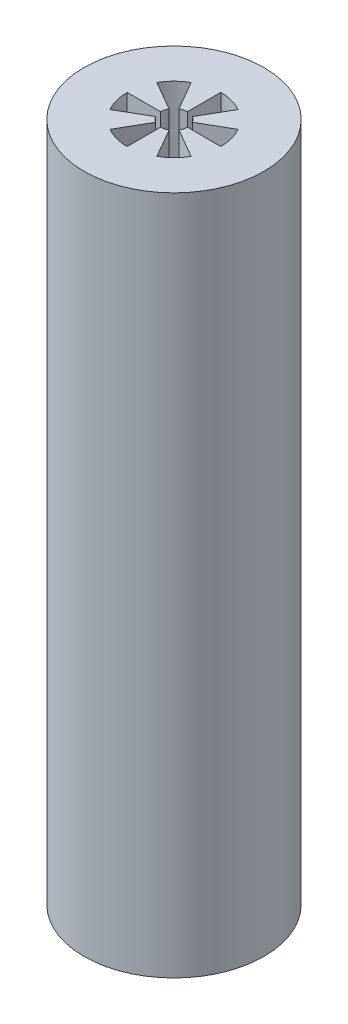
ISO-10303-21;
HEADER;
FILE_DESCRIPTION(('STEP AP214'),'2;1');
FILE_NAME('part.step','',(''),(''),'','','');
FILE_SCHEMA(('AUTOMOTIVE_DESIGN { 1 0 10303 214 1 1 1 1 }'));
ENDSEC;
DATA;
#1=APPLICATION_CONTEXT('core data for automotive mechanical design processes');
#2=APPLICATION_PROTOCOL_DEFINITION('international standard','automotive_design',2000,#1);
#3=PRODUCT_CONTEXT('',#1,'mechanical');
#4=PRODUCT('Part','Part','',(#3));
#5=PRODUCT_RELATED_PRODUCT_CATEGORY('part','',(#4));
#6=PRODUCT_DEFINITION_FORMATION('','',#4);
#7=PRODUCT_DEFINITION_CONTEXT('part definition',#1,'design');
#8=PRODUCT_DEFINITION('design','',#6,#7);
#9=PRODUCT_DEFINITION_SHAPE('','',#8);
#10=(LENGTH_UNIT() NAMED_UNIT(*) SI_UNIT(.MILLI.,.METRE.));
#11=(NAMED_UNIT(*) PLANE_ANGLE_UNIT() SI_UNIT($,.RADIAN.));
#12=(NAMED_UNIT(*) SI_UNIT($,.STERADIAN.) SOLID_ANGLE_UNIT());
#13=UNCERTAINTY_MEASURE_WITH_UNIT(LENGTH_MEASURE(1.E-05),#10,'distance_accuracy_value','');
#14=(GEOMETRIC_REPRESENTATION_CONTEXT(3) GLOBAL_UNCERTAINTY_ASSIGNED_CONTEXT((#13)) GLOBAL_UNIT_ASSIGNED_CONTEXT((#10,
#11,#12)) REPRESENTATION_CONTEXT('',''));
#15=CARTESIAN_POINT('',(0.,0.,0.));
#16=DIRECTION('',(0.,0.,1.));
#17=DIRECTION('',(1.,0.,0.));
#18=AXIS2_PLACEMENT_3D('',#15,#16,#17);
#19=CARTESIAN_POINT('',(0.,322.58,0.));
#20=DIRECTION('',(0.,1.,0.));
#21=DIRECTION('',(0.,0.,1.));
#22=AXIS2_PLACEMENT_3D('',#19,#20,#21);
#23=PLANE('',#22);
#24=CARTESIAN_POINT('',(0.,322.58,0.));
#25=DIRECTION('',(0.,1.,0.));
#26=DIRECTION('',(0.,0.,1.));
#27=AXIS2_PLACEMENT_3D('',#24,#25,#26);
#28=CIRCLE('',#27,42.672);
#29=CARTESIAN_POINT('',(0.,322.58,42.672));
#30=VERTEX_POINT('',#29);
#31=EDGE_CURVE('E11',#30,#30,#28,.T.);
#32=ORIENTED_EDGE('',*,*,#31,.T.);
#33=EDGE_LOOP('',(#32));
#34=FACE_BOUND('',#33,.T.);
#35=DIRECTION('',(0.,0.,1.));
#36=VECTOR('',#35,1.);
#37=CARTESIAN_POINT('',(0.,322.58,-6.35));
#38=LINE('',#37,#36);
#39=CARTESIAN_POINT('',(0.,322.58,-22.225));
#40=VERTEX_POINT('',#39);
#41=CARTESIAN_POINT('',(0.,322.58,-6.35));
#42=VERTEX_POINT('',#41);
#43=EDGE_CURVE('E202',#40,#42,#38,.T.);
#44=ORIENTED_EDGE('',*,*,#43,.F.);
#45=CARTESIAN_POINT('',(0.,322.58,0.));
#46=DIRECTION('',(0.,1.,0.));
#47=DIRECTION('',(0.,0.,1.));
#48=AXIS2_PLACEMENT_3D('',#45,#46,#47);
#49=CIRCLE('',#48,22.225);
#50=CARTESIAN_POINT('',(11.1125,322.58,-19.2474145991091));
#51=VERTEX_POINT('',#50);
#52=EDGE_CURVE('E194',#51,#40,#49,.T.);
#53=ORIENTED_EDGE('',*,*,#52,.F.);
#54=DIRECTION('',(0.500000000000001,0.,-0.866025403784438));
#55=VECTOR('',#54,1.);
#56=CARTESIAN_POINT('',(3.17500000000001,322.58,-5.49926131403118));
#57=LINE('',#56,#55);
#58=CARTESIAN_POINT('',(3.17500000000001,322.58,-5.49926131403118));
#59=VERTEX_POINT('',#58);
#60=EDGE_CURVE('E258',#59,#51,#57,.T.);
#61=ORIENTED_EDGE('',*,*,#60,.F.);
#62=CARTESIAN_POINT('',(0.,322.58,0.));
#63=DIRECTION('',(0.,1.,0.));
#64=DIRECTION('',(0.,0.,1.));
#65=AXIS2_PLACEMENT_3D('',#62,#63,#64);
#66=CIRCLE('',#65,6.35);
#67=CARTESIAN_POINT('',(5.49926131403119,322.58,-3.17499999999999));
#68=VERTEX_POINT('',#67);
#69=EDGE_CURVE('E256',#68,#59,#66,.T.);
#70=ORIENTED_EDGE('',*,*,#69,.F.);
#71=DIRECTION('',(-0.86602540378444,0.,0.499999999999998));
#72=VECTOR('',#71,1.);
#73=CARTESIAN_POINT('',(5.49926131403119,322.58,-3.17499999999999));
#74=LINE('',#73,#72);
#75=CARTESIAN_POINT('',(19.2474145991092,322.58,-11.1125));
#76=VERTEX_POINT('',#75);
#77=EDGE_CURVE('E254',#76,#68,#74,.T.);
#78=ORIENTED_EDGE('',*,*,#77,.F.);
#79=CARTESIAN_POINT('',(0.,322.58,0.));
#80=DIRECTION('',(0.,1.,0.));
#81=DIRECTION('',(0.,0.,1.));
#82=AXIS2_PLACEMENT_3D('',#79,#80,#81);
#83=CIRCLE('',#82,22.225);
#84=CARTESIAN_POINT('',(22.225,322.58,-9.46147849380541E-13));
#85=VERTEX_POINT('',#84);
#86=EDGE_CURVE('E252',#85,#76,#83,.T.);
#87=ORIENTED_EDGE('',*,*,#86,.F.);
#88=DIRECTION('',(1.,0.,0.));
#89=VECTOR('',#88,1.);
#90=CARTESIAN_POINT('',(6.35,322.58,-9.43814897228165E-13));
#91=LINE('',#90,#89);
#92=CARTESIAN_POINT('',(6.35,322.58,-9.43814897228165E-13));
#93=VERTEX_POINT('',#92);
#94=EDGE_CURVE('E250',#93,#85,#91,.T.);
#95=ORIENTED_EDGE('',*,*,#94,.F.);
#96=CARTESIAN_POINT('',(0.,322.58,0.));
#97=DIRECTION('',(0.,1.,0.));
#98=DIRECTION('',(0.,0.,1.));
#99=AXIS2_PLACEMENT_3D('',#96,#97,#98);
#100=CIRCLE('',#99,6.35);
#101=CARTESIAN_POINT('',(5.49926131403173,322.58,3.17499999999905));
#102=VERTEX_POINT('',#101);
#103=EDGE_CURVE('E248',#102,#93,#100,.T.);
#104=ORIENTED_EDGE('',*,*,#103,.F.);
#105=DIRECTION('',(-0.866025403784439,0.,-0.499999999999999));
#106=VECTOR('',#105,1.);
#107=CARTESIAN_POINT('',(5.49926131403173,322.58,3.17499999999905));
#108=LINE('',#107,#106);
#109=CARTESIAN_POINT('',(19.2474145991097,322.58,11.112499999999));
#110=VERTEX_POINT('',#109);
#111=EDGE_CURVE('E246',#110,#102,#108,.T.);
#112=ORIENTED_EDGE('',*,*,#111,.F.);
#113=CARTESIAN_POINT('',(0.,322.58,0.));
#114=DIRECTION('',(0.,1.,0.));
#115=DIRECTION('',(0.,0.,1.));
#116=AXIS2_PLACEMENT_3D('',#113,#114,#115);
#117=CIRCLE('',#116,22.225);
#118=CARTESIAN_POINT('',(11.1125000000009,322.58,19.2474145991086));
#119=VERTEX_POINT('',#118);
#120=EDGE_CURVE('E244',#119,#110,#117,.T.);
#121=ORIENTED_EDGE('',*,*,#120,.F.);
#122=DIRECTION('',(0.500000000000001,0.,0.866025403784438));
#123=VECTOR('',#122,1.);
#124=CARTESIAN_POINT('',(3.17500000000093,322.58,5.49926131403065));
#125=LINE('',#124,#123);
#126=CARTESIAN_POINT('',(3.17500000000093,322.58,5.49926131403065));
#127=VERTEX_POINT('',#126);
#128=EDGE_CURVE('E242',#127,#119,#125,.T.);
#129=ORIENTED_EDGE('',*,*,#128,.F.);
#130=CARTESIAN_POINT('',(0.,322.58,0.));
#131=DIRECTION('',(0.,1.,0.));
#132=DIRECTION('',(0.,0.,1.));
#133=AXIS2_PLACEMENT_3D('',#130,#131,#132);
#134=CIRCLE('',#133,6.35);
#135=CARTESIAN_POINT('',(1.88762979445633E-12,322.58,6.35));
#136=VERTEX_POINT('',#135);
#137=EDGE_CURVE('E240',#136,#127,#134,.T.);
#138=ORIENTED_EDGE('',*,*,#137,.F.);
#139=DIRECTION('',(0.,0.,-1.));
#140=VECTOR('',#139,1.);
#141=CARTESIAN_POINT('',(1.88762979445633E-12,322.58,6.35));
#142=LINE('',#141,#140);
#143=CARTESIAN_POINT('',(1.88983742031192E-12,322.58,22.225));
#144=VERTEX_POINT('',#143);
#145=EDGE_CURVE('E238',#144,#136,#142,.T.);
#146=ORIENTED_EDGE('',*,*,#145,.F.);
#147=CARTESIAN_POINT('',(0.,322.58,0.));
#148=DIRECTION('',(0.,1.,0.));
#149=DIRECTION('',(0.,0.,1.));
#150=AXIS2_PLACEMENT_3D('',#147,#148,#149);
#151=CIRCLE('',#150,22.225);
#152=CARTESIAN_POINT('',(-11.1124999999985,322.58,19.24741459911));
#153=VERTEX_POINT('',#152);
#154=EDGE_CURVE('E236',#153,#144,#151,.T.);
#155=ORIENTED_EDGE('',*,*,#154,.F.);
#156=DIRECTION('',(-0.499999999999999,0.,0.866025403784439));
#157=VECTOR('',#156,1.);
#158=CARTESIAN_POINT('',(-3.17499999999847,322.58,5.49926131403207));
#159=LINE('',#158,#157);
#160=CARTESIAN_POINT('',(-3.17499999999847,322.58,5.49926131403207));
#161=VERTEX_POINT('',#160);
#162=EDGE_CURVE('E234',#161,#153,#159,.T.);
#163=ORIENTED_EDGE('',*,*,#162,.F.);
#164=CARTESIAN_POINT('',(0.,322.58,0.));
#165=DIRECTION('',(0.,1.,0.));
#166=DIRECTION('',(0.,0.,1.));
#167=AXIS2_PLACEMENT_3D('',#164,#165,#166);
#168=CIRCLE('',#167,6.35);
#169=CARTESIAN_POINT('',(-5.49926131403048,322.58,3.17500000000123));
#170=VERTEX_POINT('',#169);
#171=EDGE_CURVE('E232',#170,#161,#168,.T.);
#172=ORIENTED_EDGE('',*,*,#171,.F.);
#173=DIRECTION('',(0.866025403784438,0.,-0.5));
#174=VECTOR('',#173,1.);
#175=CARTESIAN_POINT('',(-5.49926131403048,322.58,3.17500000000123));
#176=LINE('',#175,#174);
#177=CARTESIAN_POINT('',(-19.2474145991084,322.58,11.1125000000012));
#178=VERTEX_POINT('',#177);
#179=EDGE_CURVE('E230',#178,#170,#176,.T.);
#180=ORIENTED_EDGE('',*,*,#179,.F.);
#181=CARTESIAN_POINT('',(0.,322.58,0.));
#182=DIRECTION('',(0.,1.,0.));
#183=DIRECTION('',(0.,0.,1.));
#184=AXIS2_PLACEMENT_3D('',#181,#182,#183);
#185=CIRCLE('',#184,22.225);
#186=CARTESIAN_POINT('',(-22.225,322.58,9.43426071869436E-13));
#187=VERTEX_POINT('',#186);
#188=EDGE_CURVE('E228',#187,#178,#185,.T.);
#189=ORIENTED_EDGE('',*,*,#188,.F.);
#190=DIRECTION('',(-1.,0.,0.));
#191=VECTOR('',#190,1.);
#192=CARTESIAN_POINT('',(-6.35,322.58,9.44592547945624E-13));
#193=LINE('',#192,#191);
#194=CARTESIAN_POINT('',(-6.35,322.58,9.44592547945624E-13));
#195=VERTEX_POINT('',#194);
#196=EDGE_CURVE('E226',#195,#187,#193,.T.);
#197=ORIENTED_EDGE('',*,*,#196,.F.);
#198=CARTESIAN_POINT('',(0.,322.58,0.));
#199=DIRECTION('',(0.,1.,0.));
#200=DIRECTION('',(0.,0.,1.));
#201=AXIS2_PLACEMENT_3D('',#198,#199,#200);
#202=CIRCLE('',#201,6.35);
#203=CARTESIAN_POINT('',(-5.49926131403115,322.58,-3.17500000000007));
#204=VERTEX_POINT('',#203);
#205=EDGE_CURVE('E224',#204,#195,#202,.T.);
#206=ORIENTED_EDGE('',*,*,#205,.F.);
#207=DIRECTION('',(0.866025403784433,0.,0.50000000000001));
#208=VECTOR('',#207,1.);
#209=CARTESIAN_POINT('',(-5.49926131403115,322.58,-3.17500000000006));
#210=LINE('',#209,#208);
#211=CARTESIAN_POINT('',(-19.247414599109,322.58,-11.1125000000002));
#212=VERTEX_POINT('',#211);
#213=EDGE_CURVE('E222',#212,#204,#210,.T.);
#214=ORIENTED_EDGE('',*,*,#213,.F.);
#215=CARTESIAN_POINT('',(0.,322.58,0.));
#216=DIRECTION('',(0.,1.,0.));
#217=DIRECTION('',(0.,0.,1.));
#218=AXIS2_PLACEMENT_3D('',#215,#216,#217);
#219=CIRCLE('',#218,22.225);
#220=CARTESIAN_POINT('',(-11.1124999999997,322.58,-19.2474145991093));
#221=VERTEX_POINT('',#220);
#222=EDGE_CURVE('E220',#221,#212,#219,.T.);
#223=ORIENTED_EDGE('',*,*,#222,.F.);
#224=DIRECTION('',(-0.499999999999989,0.,-0.866025403784445));
#225=VECTOR('',#224,1.);
#226=CARTESIAN_POINT('',(-3.17499999999993,322.58,-5.49926131403123));
#227=LINE('',#226,#225);
#228=CARTESIAN_POINT('',(-3.17499999999993,322.58,-5.49926131403123));
#229=VERTEX_POINT('',#228);
#230=EDGE_CURVE('E216',#229,#221,#227,.T.);
#231=ORIENTED_EDGE('',*,*,#230,.F.);
#232=CARTESIAN_POINT('',(0.,322.58,0.));
#233=DIRECTION('',(0.,1.,0.));
#234=DIRECTION('',(0.,0.,1.));
#235=AXIS2_PLACEMENT_3D('',#232,#233,#234);
#236=CIRCLE('',#235,6.35);
#237=EDGE_CURVE('E214',#42,#229,#236,.T.);
#238=ORIENTED_EDGE('',*,*,#237,.F.);
#239=EDGE_LOOP('',(#44,#53,#61,#70,#78,#87,#95,#104,#112,#121,#129,#138,#146,#155,#163,#172,
#180,#189,#197,#206,#214,#223,#231,#238));
#240=FACE_BOUND('',#239,.T.);
#241=ADVANCED_FACE('F33',(#34,#240),#23,.T.);
#242=CARTESIAN_POINT('',(0.,0.,0.));
#243=DIRECTION('',(0.,1.,0.));
#244=DIRECTION('',(0.,0.,1.));
#245=AXIS2_PLACEMENT_3D('',#242,#243,#244);
#246=PLANE('',#245);
#247=CARTESIAN_POINT('',(0.,0.,0.));
#248=DIRECTION('',(0.,1.,0.));
#249=DIRECTION('',(0.,0.,1.));
#250=AXIS2_PLACEMENT_3D('',#247,#248,#249);
#251=CIRCLE('',#250,42.672);
#252=CARTESIAN_POINT('',(0.,0.,42.672));
#253=VERTEX_POINT('',#252);
#254=EDGE_CURVE('E37',#253,#253,#251,.T.);
#255=ORIENTED_EDGE('',*,*,#254,.F.);
#256=EDGE_LOOP('',(#255));
#257=FACE_BOUND('',#256,.T.);
#258=CARTESIAN_POINT('',(0.,0.,0.));
#259=DIRECTION('',(0.,1.,0.));
#260=DIRECTION('',(0.,0.,1.));
#261=AXIS2_PLACEMENT_3D('',#258,#259,#260);
#262=CIRCLE('',#261,22.225);
#263=CARTESIAN_POINT('',(11.1125,0.,-19.2474145991091));
#264=VERTEX_POINT('',#263);
#265=CARTESIAN_POINT('',(0.,0.,-22.225));
#266=VERTEX_POINT('',#265);
#267=EDGE_CURVE('E56',#264,#266,#262,.T.);
#268=ORIENTED_EDGE('',*,*,#267,.T.);
#269=DIRECTION('',(0.,0.,1.));
#270=VECTOR('',#269,1.);
#271=CARTESIAN_POINT('',(0.,0.,-6.35));
#272=LINE('',#271,#270);
#273=CARTESIAN_POINT('',(0.,0.,-6.35));
#274=VERTEX_POINT('',#273);
#275=EDGE_CURVE('E209',#266,#274,#272,.T.);
#276=ORIENTED_EDGE('',*,*,#275,.T.);
#277=CARTESIAN_POINT('',(0.,0.,0.));
#278=DIRECTION('',(0.,1.,0.));
#279=DIRECTION('',(0.,0.,1.));
#280=AXIS2_PLACEMENT_3D('',#277,#278,#279);
#281=CIRCLE('',#280,6.35);
#282=CARTESIAN_POINT('',(-3.17499999999993,0.,-5.49926131403123));
#283=VERTEX_POINT('',#282);
#284=EDGE_CURVE('E262',#274,#283,#281,.T.);
#285=ORIENTED_EDGE('',*,*,#284,.T.);
#286=DIRECTION('',(-0.499999999999989,0.,-0.866025403784445));
#287=VECTOR('',#286,1.);
#288=CARTESIAN_POINT('',(-3.17499999999993,0.,-5.49926131403123));
#289=LINE('',#288,#287);
#290=CARTESIAN_POINT('',(-11.1124999999997,0.,-19.2474145991093));
#291=VERTEX_POINT('',#290);
#292=EDGE_CURVE('E265',#283,#291,#289,.T.);
#293=ORIENTED_EDGE('',*,*,#292,.T.);
#294=CARTESIAN_POINT('',(0.,0.,0.));
#295=DIRECTION('',(0.,1.,0.));
#296=DIRECTION('',(0.,0.,1.));
#297=AXIS2_PLACEMENT_3D('',#294,#295,#296);
#298=CIRCLE('',#297,22.225);
#299=CARTESIAN_POINT('',(-19.247414599109,0.,-11.1125000000002));
#300=VERTEX_POINT('',#299);
#301=EDGE_CURVE('E268',#291,#300,#298,.T.);
#302=ORIENTED_EDGE('',*,*,#301,.T.);
#303=DIRECTION('',(0.866025403784433,0.,0.50000000000001));
#304=VECTOR('',#303,1.);
#305=CARTESIAN_POINT('',(-5.49926131403115,0.,-3.17500000000006));
#306=LINE('',#305,#304);
#307=CARTESIAN_POINT('',(-5.49926131403115,0.,-3.17500000000007));
#308=VERTEX_POINT('',#307);
#309=EDGE_CURVE('E271',#300,#308,#306,.T.);
#310=ORIENTED_EDGE('',*,*,#309,.T.);
#311=CARTESIAN_POINT('',(0.,0.,0.));
#312=DIRECTION('',(0.,1.,0.));
#313=DIRECTION('',(0.,0.,1.));
#314=AXIS2_PLACEMENT_3D('',#311,#312,#313);
#315=CIRCLE('',#314,6.35);
#316=CARTESIAN_POINT('',(-6.35,0.,9.44592547945624E-13));
#317=VERTEX_POINT('',#316);
#318=EDGE_CURVE('E274',#308,#317,#315,.T.);
#319=ORIENTED_EDGE('',*,*,#318,.T.);
#320=DIRECTION('',(-1.,0.,0.));
#321=VECTOR('',#320,1.);
#322=CARTESIAN_POINT('',(-6.35,0.,9.44592547945624E-13));
#323=LINE('',#322,#321);
#324=CARTESIAN_POINT('',(-22.225,0.,9.43426071869436E-13));
#325=VERTEX_POINT('',#324);
#326=EDGE_CURVE('E277',#317,#325,#323,.T.);
#327=ORIENTED_EDGE('',*,*,#326,.T.);
#328=CARTESIAN_POINT('',(0.,0.,0.));
#329=DIRECTION('',(0.,1.,0.));
#330=DIRECTION('',(0.,0.,1.));
#331=AXIS2_PLACEMENT_3D('',#328,#329,#330);
#332=CIRCLE('',#331,22.225);
#333=CARTESIAN_POINT('',(-19.2474145991084,0.,11.1125000000012));
#334=VERTEX_POINT('',#333);
#335=EDGE_CURVE('E280',#325,#334,#332,.T.);
#336=ORIENTED_EDGE('',*,*,#335,.T.);
#337=DIRECTION('',(0.866025403784438,0.,-0.5));
#338=VECTOR('',#337,1.);
#339=CARTESIAN_POINT('',(-5.49926131403048,0.,3.17500000000123));
#340=LINE('',#339,#338);
#341=CARTESIAN_POINT('',(-5.49926131403048,0.,3.17500000000123));
#342=VERTEX_POINT('',#341);
#343=EDGE_CURVE('E283',#334,#342,#340,.T.);
#344=ORIENTED_EDGE('',*,*,#343,.T.);
#345=CARTESIAN_POINT('',(0.,0.,0.));
#346=DIRECTION('',(0.,1.,0.));
#347=DIRECTION('',(0.,0.,1.));
#348=AXIS2_PLACEMENT_3D('',#345,#346,#347);
#349=CIRCLE('',#348,6.35);
#350=CARTESIAN_POINT('',(-3.17499999999847,0.,5.49926131403207));
#351=VERTEX_POINT('',#350);
#352=EDGE_CURVE('E286',#342,#351,#349,.T.);
#353=ORIENTED_EDGE('',*,*,#352,.T.);
#354=DIRECTION('',(-0.499999999999999,0.,0.866025403784439));
#355=VECTOR('',#354,1.);
#356=CARTESIAN_POINT('',(-3.17499999999847,0.,5.49926131403207));
#357=LINE('',#356,#355);
#358=CARTESIAN_POINT('',(-11.1124999999985,0.,19.24741459911));
#359=VERTEX_POINT('',#358);
#360=EDGE_CURVE('E289',#351,#359,#357,.T.);
#361=ORIENTED_EDGE('',*,*,#360,.T.);
#362=CARTESIAN_POINT('',(0.,0.,0.));
#363=DIRECTION('',(0.,1.,0.));
#364=DIRECTION('',(0.,0.,1.));
#365=AXIS2_PLACEMENT_3D('',#362,#363,#364);
#366=CIRCLE('',#365,22.225);
#367=CARTESIAN_POINT('',(1.88983742031192E-12,0.,22.225));
#368=VERTEX_POINT('',#367);
#369=EDGE_CURVE('E292',#359,#368,#366,.T.);
#370=ORIENTED_EDGE('',*,*,#369,.T.);
#371=DIRECTION('',(0.,0.,-1.));
#372=VECTOR('',#371,1.);
#373=CARTESIAN_POINT('',(1.88762979445633E-12,0.,6.35));
#374=LINE('',#373,#372);
#375=CARTESIAN_POINT('',(1.88762979445633E-12,0.,6.35));
#376=VERTEX_POINT('',#375);
#377=EDGE_CURVE('E295',#368,#376,#374,.T.);
#378=ORIENTED_EDGE('',*,*,#377,.T.);
#379=CARTESIAN_POINT('',(0.,0.,0.));
#380=DIRECTION('',(0.,1.,0.));
#381=DIRECTION('',(0.,0.,1.));
#382=AXIS2_PLACEMENT_3D('',#379,#380,#381);
#383=CIRCLE('',#382,6.35);
#384=CARTESIAN_POINT('',(3.17500000000093,0.,5.49926131403065));
#385=VERTEX_POINT('',#384);
#386=EDGE_CURVE('E298',#376,#385,#383,.T.);
#387=ORIENTED_EDGE('',*,*,#386,.T.);
#388=DIRECTION('',(0.500000000000001,0.,0.866025403784438));
#389=VECTOR('',#388,1.);
#390=CARTESIAN_POINT('',(3.17500000000093,0.,5.49926131403065));
#391=LINE('',#390,#389);
#392=CARTESIAN_POINT('',(11.1125000000009,0.,19.2474145991086));
#393=VERTEX_POINT('',#392);
#394=EDGE_CURVE('E301',#385,#393,#391,.T.);
#395=ORIENTED_EDGE('',*,*,#394,.T.);
#396=CARTESIAN_POINT('',(0.,0.,0.));
#397=DIRECTION('',(0.,1.,0.));
#398=DIRECTION('',(0.,0.,1.));
#399=AXIS2_PLACEMENT_3D('',#396,#397,#398);
#400=CIRCLE('',#399,22.225);
#401=CARTESIAN_POINT('',(19.2474145991097,0.,11.112499999999));
#402=VERTEX_POINT('',#401);
#403=EDGE_CURVE('E304',#393,#402,#400,.T.);
#404=ORIENTED_EDGE('',*,*,#403,.T.);
#405=DIRECTION('',(-0.866025403784439,0.,-0.499999999999999));
#406=VECTOR('',#405,1.);
#407=CARTESIAN_POINT('',(5.49926131403173,0.,3.17499999999905));
#408=LINE('',#407,#406);
#409=CARTESIAN_POINT('',(5.49926131403173,0.,3.17499999999905));
#410=VERTEX_POINT('',#409);
#411=EDGE_CURVE('E307',#402,#410,#408,.T.);
#412=ORIENTED_EDGE('',*,*,#411,.T.);
#413=CARTESIAN_POINT('',(0.,0.,0.));
#414=DIRECTION('',(0.,1.,0.));
#415=DIRECTION('',(0.,0.,1.));
#416=AXIS2_PLACEMENT_3D('',#413,#414,#415);
#417=CIRCLE('',#416,6.35);
#418=CARTESIAN_POINT('',(6.35,0.,-9.43814897228165E-13));
#419=VERTEX_POINT('',#418);
#420=EDGE_CURVE('E310',#410,#419,#417,.T.);
#421=ORIENTED_EDGE('',*,*,#420,.T.);
#422=DIRECTION('',(1.,0.,0.));
#423=VECTOR('',#422,1.);
#424=CARTESIAN_POINT('',(6.35,0.,-9.43814897228165E-13));
#425=LINE('',#424,#423);
#426=CARTESIAN_POINT('',(22.225,0.,-9.46147849380541E-13));
#427=VERTEX_POINT('',#426);
#428=EDGE_CURVE('E313',#419,#427,#425,.T.);
#429=ORIENTED_EDGE('',*,*,#428,.T.);
#430=CARTESIAN_POINT('',(0.,0.,0.));
#431=DIRECTION('',(0.,1.,0.));
#432=DIRECTION('',(0.,0.,1.));
#433=AXIS2_PLACEMENT_3D('',#430,#431,#432);
#434=CIRCLE('',#433,22.225);
#435=CARTESIAN_POINT('',(19.2474145991092,0.,-11.1125));
#436=VERTEX_POINT('',#435);
#437=EDGE_CURVE('E316',#427,#436,#434,.T.);
#438=ORIENTED_EDGE('',*,*,#437,.T.);
#439=DIRECTION('',(-0.86602540378444,0.,0.499999999999998));
#440=VECTOR('',#439,1.);
#441=CARTESIAN_POINT('',(5.49926131403119,0.,-3.17499999999999));
#442=LINE('',#441,#440);
#443=CARTESIAN_POINT('',(5.49926131403119,0.,-3.17499999999999));
#444=VERTEX_POINT('',#443);
#445=EDGE_CURVE('E319',#436,#444,#442,.T.);
#446=ORIENTED_EDGE('',*,*,#445,.T.);
#447=CARTESIAN_POINT('',(0.,0.,0.));
#448=DIRECTION('',(0.,1.,0.));
#449=DIRECTION('',(0.,0.,1.));
#450=AXIS2_PLACEMENT_3D('',#447,#448,#449);
#451=CIRCLE('',#450,6.35);
#452=CARTESIAN_POINT('',(3.17500000000001,0.,-5.49926131403118));
#453=VERTEX_POINT('',#452);
#454=EDGE_CURVE('E322',#444,#453,#451,.T.);
#455=ORIENTED_EDGE('',*,*,#454,.T.);
#456=DIRECTION('',(0.500000000000001,0.,-0.866025403784438));
#457=VECTOR('',#456,1.);
#458=CARTESIAN_POINT('',(3.17500000000001,0.,-5.49926131403118));
#459=LINE('',#458,#457);
#460=EDGE_CURVE('E203',#453,#264,#459,.T.);
#461=ORIENTED_EDGE('',*,*,#460,.T.);
#462=EDGE_LOOP('',(#268,#276,#285,#293,#302,#310,#319,#327,#336,#344,#353,#361,#370,#378,#387,
#395,#404,#412,#421,#429,#438,#446,#455,#461));
#463=FACE_BOUND('',#462,.T.);
#464=ADVANCED_FACE('F375',(#257,#463),#246,.F.);
#465=CARTESIAN_POINT('',(0.,322.58,0.));
#466=DIRECTION('',(0.,-1.,0.));
#467=DIRECTION('',(0.,0.,-1.));
#468=AXIS2_PLACEMENT_3D('',#465,#466,#467);
#469=CYLINDRICAL_SURFACE('',#468,42.672);
#470=ORIENTED_EDGE('',*,*,#31,.F.);
#471=EDGE_LOOP('',(#470));
#472=FACE_BOUND('',#471,.T.);
#473=ORIENTED_EDGE('',*,*,#254,.T.);
#474=EDGE_LOOP('',(#473));
#475=FACE_BOUND('',#474,.T.);
#476=ADVANCED_FACE('F35',(#472,#475),#469,.T.);
#477=CARTESIAN_POINT('',(0.,322.58,0.));
#478=DIRECTION('',(0.,-1.,0.));
#479=DIRECTION('',(0.,0.,-1.));
#480=AXIS2_PLACEMENT_3D('',#477,#478,#479);
#481=CYLINDRICAL_SURFACE('',#480,22.225);
#482=ORIENTED_EDGE('',*,*,#267,.F.);
#483=DIRECTION('',(0.,-1.,0.));
#484=VECTOR('',#483,1.);
#485=CARTESIAN_POINT('',(11.1125,322.58,-19.2474145991091));
#486=LINE('',#485,#484);
#487=EDGE_CURVE('E198',#51,#264,#486,.T.);
#488=ORIENTED_EDGE('',*,*,#487,.F.);
#489=ORIENTED_EDGE('',*,*,#52,.T.);
#490=DIRECTION('',(0.,-1.,0.));
#491=VECTOR('',#490,1.);
#492=CARTESIAN_POINT('',(0.,322.58,-22.225));
#493=LINE('',#492,#491);
#494=EDGE_CURVE('E197',#40,#266,#493,.T.);
#495=ORIENTED_EDGE('',*,*,#494,.T.);
#496=EDGE_LOOP('',(#482,#488,#489,#495));
#497=FACE_BOUND('',#496,.T.);
#498=ADVANCED_FACE('F196',(#497),#481,.F.);
#499=CARTESIAN_POINT('',(0.,322.58,-6.35));
#500=DIRECTION('',(1.,0.,0.));
#501=DIRECTION('',(0.,0.,-1.));
#502=AXIS2_PLACEMENT_3D('',#499,#500,#501);
#503=PLANE('',#502);
#504=ORIENTED_EDGE('',*,*,#275,.F.);
#505=ORIENTED_EDGE('',*,*,#494,.F.);
#506=ORIENTED_EDGE('',*,*,#43,.T.);
#507=DIRECTION('',(0.,-1.,0.));
#508=VECTOR('',#507,1.);
#509=CARTESIAN_POINT('',(0.,322.58,-6.35));
#510=LINE('',#509,#508);
#511=EDGE_CURVE('E210',#42,#274,#510,.T.);
#512=ORIENTED_EDGE('',*,*,#511,.T.);
#513=EDGE_LOOP('',(#504,#505,#506,#512));
#514=FACE_BOUND('',#513,.T.);
#515=ADVANCED_FACE('F206',(#514),#503,.T.);
#516=CARTESIAN_POINT('',(0.,322.58,0.));
#517=DIRECTION('',(0.,-1.,0.));
#518=DIRECTION('',(0.,0.,-1.));
#519=AXIS2_PLACEMENT_3D('',#516,#517,#518);
#520=CYLINDRICAL_SURFACE('',#519,6.35);
#521=ORIENTED_EDGE('',*,*,#284,.F.);
#522=ORIENTED_EDGE('',*,*,#511,.F.);
#523=ORIENTED_EDGE('',*,*,#237,.T.);
#524=DIRECTION('',(0.,-1.,0.));
#525=VECTOR('',#524,1.);
#526=CARTESIAN_POINT('',(-3.17499999999993,322.58,-5.49926131403123));
#527=LINE('',#526,#525);
#528=EDGE_CURVE('E367',#229,#283,#527,.T.);
#529=ORIENTED_EDGE('',*,*,#528,.T.);
#530=EDGE_LOOP('',(#521,#522,#523,#529));
#531=FACE_BOUND('',#530,.T.);
#532=ADVANCED_FACE('F371',(#531),#520,.F.);
#533=CARTESIAN_POINT('',(-3.17499999999993,322.58,-5.49926131403123));
#534=DIRECTION('',(-0.866025403784445,0.,0.499999999999989));
#535=DIRECTION('',(0.499999999999989,0.,0.866025403784445));
#536=AXIS2_PLACEMENT_3D('',#533,#534,#535);
#537=PLANE('',#536);
#538=ORIENTED_EDGE('',*,*,#292,.F.);
#539=ORIENTED_EDGE('',*,*,#528,.F.);
#540=ORIENTED_EDGE('',*,*,#230,.T.);
#541=DIRECTION('',(0.,-1.,0.));
#542=VECTOR('',#541,1.);
#543=CARTESIAN_POINT('',(-11.1124999999997,322.58,-19.2474145991093));
#544=LINE('',#543,#542);
#545=EDGE_CURVE('E365',#221,#291,#544,.T.);
#546=ORIENTED_EDGE('',*,*,#545,.T.);
#547=EDGE_LOOP('',(#538,#539,#540,#546));
#548=FACE_BOUND('',#547,.T.);
#549=ADVANCED_FACE('F473',(#548),#537,.T.);
#550=CARTESIAN_POINT('',(0.,322.58,0.));
#551=DIRECTION('',(0.,-1.,0.));
#552=DIRECTION('',(0.,0.,-1.));
#553=AXIS2_PLACEMENT_3D('',#550,#551,#552);
#554=CYLINDRICAL_SURFACE('',#553,22.225);
#555=ORIENTED_EDGE('',*,*,#301,.F.);
#556=ORIENTED_EDGE('',*,*,#545,.F.);
#557=ORIENTED_EDGE('',*,*,#222,.T.);
#558=DIRECTION('',(0.,-1.,0.));
#559=VECTOR('',#558,1.);
#560=CARTESIAN_POINT('',(-19.247414599109,322.58,-11.1125000000002));
#561=LINE('',#560,#559);
#562=EDGE_CURVE('E363',#212,#300,#561,.T.);
#563=ORIENTED_EDGE('',*,*,#562,.T.);
#564=EDGE_LOOP('',(#555,#556,#557,#563));
#565=FACE_BOUND('',#564,.T.);
#566=ADVANCED_FACE('F471',(#565),#554,.F.);
#567=CARTESIAN_POINT('',(-5.49926131403115,322.58,-3.17500000000006));
#568=DIRECTION('',(0.50000000000001,0.,-0.866025403784433));
#569=DIRECTION('',(-0.866025403784433,0.,-0.50000000000001));
#570=AXIS2_PLACEMENT_3D('',#567,#568,#569);
#571=PLANE('',#570);
#572=ORIENTED_EDGE('',*,*,#309,.F.);
#573=ORIENTED_EDGE('',*,*,#562,.F.);
#574=ORIENTED_EDGE('',*,*,#213,.T.);
#575=DIRECTION('',(0.,-1.,0.));
#576=VECTOR('',#575,1.);
#577=CARTESIAN_POINT('',(-5.49926131403115,322.58,-3.17500000000007));
#578=LINE('',#577,#576);
#579=EDGE_CURVE('E361',#204,#308,#578,.T.);
#580=ORIENTED_EDGE('',*,*,#579,.T.);
#581=EDGE_LOOP('',(#572,#573,#574,#580));
#582=FACE_BOUND('',#581,.T.);
#583=ADVANCED_FACE('F465',(#582),#571,.T.);
#584=CARTESIAN_POINT('',(0.,322.58,0.));
#585=DIRECTION('',(0.,-1.,0.));
#586=DIRECTION('',(0.,0.,-1.));
#587=AXIS2_PLACEMENT_3D('',#584,#585,#586);
#588=CYLINDRICAL_SURFACE('',#587,6.35);
#589=ORIENTED_EDGE('',*,*,#318,.F.);
#590=ORIENTED_EDGE('',*,*,#579,.F.);
#591=ORIENTED_EDGE('',*,*,#205,.T.);
#592=DIRECTION('',(0.,-1.,0.));
#593=VECTOR('',#592,1.);
#594=CARTESIAN_POINT('',(-6.35,322.58,9.44592547945624E-13));
#595=LINE('',#594,#593);
#596=EDGE_CURVE('E359',#195,#317,#595,.T.);
#597=ORIENTED_EDGE('',*,*,#596,.T.);
#598=EDGE_LOOP('',(#589,#590,#591,#597));
#599=FACE_BOUND('',#598,.T.);
#600=ADVANCED_FACE('F461',(#599),#588,.F.);
#601=CARTESIAN_POINT('',(-6.35,322.58,9.44592547945624E-13));
#602=DIRECTION('',(0.,0.,1.));
#603=DIRECTION('',(1.,0.,0.));
#604=AXIS2_PLACEMENT_3D('',#601,#602,#603);
#605=PLANE('',#604);
#606=ORIENTED_EDGE('',*,*,#326,.F.);
#607=ORIENTED_EDGE('',*,*,#596,.F.);
#608=ORIENTED_EDGE('',*,*,#196,.T.);
#609=DIRECTION('',(0.,-1.,0.));
#610=VECTOR('',#609,1.);
#611=CARTESIAN_POINT('',(-22.225,322.58,9.43426071869436E-13));
#612=LINE('',#611,#610);
#613=EDGE_CURVE('E357',#187,#325,#612,.T.);
#614=ORIENTED_EDGE('',*,*,#613,.T.);
#615=EDGE_LOOP('',(#606,#607,#608,#614));
#616=FACE_BOUND('',#615,.T.);
#617=ADVANCED_FACE('F458',(#616),#605,.T.);
#618=CARTESIAN_POINT('',(0.,322.58,0.));
#619=DIRECTION('',(0.,-1.,0.));
#620=DIRECTION('',(0.,0.,-1.));
#621=AXIS2_PLACEMENT_3D('',#618,#619,#620);
#622=CYLINDRICAL_SURFACE('',#621,22.225);
#623=ORIENTED_EDGE('',*,*,#335,.F.);
#624=ORIENTED_EDGE('',*,*,#613,.F.);
#625=ORIENTED_EDGE('',*,*,#188,.T.);
#626=DIRECTION('',(0.,-1.,0.));
#627=VECTOR('',#626,1.);
#628=CARTESIAN_POINT('',(-19.2474145991084,322.58,11.1125000000012));
#629=LINE('',#628,#627);
#630=EDGE_CURVE('E355',#178,#334,#629,.T.);
#631=ORIENTED_EDGE('',*,*,#630,.T.);
#632=EDGE_LOOP('',(#623,#624,#625,#631));
#633=FACE_BOUND('',#632,.T.);
#634=ADVANCED_FACE('F450',(#633),#622,.F.);
#635=CARTESIAN_POINT('',(-5.49926131403048,322.58,3.17500000000123));
#636=DIRECTION('',(-0.5,0.,-0.866025403784438));
#637=DIRECTION('',(-0.866025403784438,0.,0.5));
#638=AXIS2_PLACEMENT_3D('',#635,#636,#637);
#639=PLANE('',#638);
#640=ORIENTED_EDGE('',*,*,#343,.F.);
#641=ORIENTED_EDGE('',*,*,#630,.F.);
#642=ORIENTED_EDGE('',*,*,#179,.T.);
#643=DIRECTION('',(0.,-1.,0.));
#644=VECTOR('',#643,1.);
#645=CARTESIAN_POINT('',(-5.49926131403048,322.58,3.17500000000123));
#646=LINE('',#645,#644);
#647=EDGE_CURVE('E353',#170,#342,#646,.T.);
#648=ORIENTED_EDGE('',*,*,#647,.T.);
#649=EDGE_LOOP('',(#640,#641,#642,#648));
#650=FACE_BOUND('',#649,.T.);
#651=ADVANCED_FACE('F446',(#650),#639,.T.);
#652=CARTESIAN_POINT('',(0.,322.58,0.));
#653=DIRECTION('',(0.,-1.,0.));
#654=DIRECTION('',(0.,0.,-1.));
#655=AXIS2_PLACEMENT_3D('',#652,#653,#654);
#656=CYLINDRICAL_SURFACE('',#655,6.35);
#657=ORIENTED_EDGE('',*,*,#352,.F.);
#658=ORIENTED_EDGE('',*,*,#647,.F.);
#659=ORIENTED_EDGE('',*,*,#171,.T.);
#660=DIRECTION('',(0.,-1.,0.));
#661=VECTOR('',#660,1.);
#662=CARTESIAN_POINT('',(-3.17499999999847,322.58,5.49926131403207));
#663=LINE('',#662,#661);
#664=EDGE_CURVE('E351',#161,#351,#663,.T.);
#665=ORIENTED_EDGE('',*,*,#664,.T.);
#666=EDGE_LOOP('',(#657,#658,#659,#665));
#667=FACE_BOUND('',#666,.T.);
#668=ADVANCED_FACE('F443',(#667),#656,.F.);
#669=CARTESIAN_POINT('',(-3.17499999999847,322.58,5.49926131403207));
#670=DIRECTION('',(0.866025403784439,0.,0.499999999999999));
#671=DIRECTION('',(0.499999999999999,0.,-0.866025403784439));
#672=AXIS2_PLACEMENT_3D('',#669,#670,#671);
#673=PLANE('',#672);
#674=ORIENTED_EDGE('',*,*,#360,.F.);
#675=ORIENTED_EDGE('',*,*,#664,.F.);
#676=ORIENTED_EDGE('',*,*,#162,.T.);
#677=DIRECTION('',(0.,-1.,0.));
#678=VECTOR('',#677,1.);
#679=CARTESIAN_POINT('',(-11.1124999999985,322.58,19.24741459911));
#680=LINE('',#679,#678);
#681=EDGE_CURVE('E349',#153,#359,#680,.T.);
#682=ORIENTED_EDGE('',*,*,#681,.T.);
#683=EDGE_LOOP('',(#674,#675,#676,#682));
#684=FACE_BOUND('',#683,.T.);
#685=ADVANCED_FACE('F435',(#684),#673,.T.);
#686=CARTESIAN_POINT('',(0.,322.58,0.));
#687=DIRECTION('',(0.,-1.,0.));
#688=DIRECTION('',(0.,0.,-1.));
#689=AXIS2_PLACEMENT_3D('',#686,#687,#688);
#690=CYLINDRICAL_SURFACE('',#689,22.225);
#691=ORIENTED_EDGE('',*,*,#369,.F.);
#692=ORIENTED_EDGE('',*,*,#681,.F.);
#693=ORIENTED_EDGE('',*,*,#154,.T.);
#694=DIRECTION('',(0.,-1.,0.));
#695=VECTOR('',#694,1.);
#696=CARTESIAN_POINT('',(1.88983742031192E-12,322.58,22.225));
#697=LINE('',#696,#695);
#698=EDGE_CURVE('E347',#144,#368,#697,.T.);
#699=ORIENTED_EDGE('',*,*,#698,.T.);
#700=EDGE_LOOP('',(#691,#692,#693,#699));
#701=FACE_BOUND('',#700,.T.);
#702=ADVANCED_FACE('F431',(#701),#690,.F.);
#703=CARTESIAN_POINT('',(1.88762979445633E-12,322.58,6.35));
#704=DIRECTION('',(-1.,0.,0.));
#705=DIRECTION('',(0.,0.,1.));
#706=AXIS2_PLACEMENT_3D('',#703,#704,#705);
#707=PLANE('',#706);
#708=ORIENTED_EDGE('',*,*,#377,.F.);
#709=ORIENTED_EDGE('',*,*,#698,.F.);
#710=ORIENTED_EDGE('',*,*,#145,.T.);
#711=DIRECTION('',(0.,-1.,0.));
#712=VECTOR('',#711,1.);
#713=CARTESIAN_POINT('',(1.88762979445633E-12,322.58,6.35));
#714=LINE('',#713,#712);
#715=EDGE_CURVE('E345',#136,#376,#714,.T.);
#716=ORIENTED_EDGE('',*,*,#715,.T.);
#717=EDGE_LOOP('',(#708,#709,#710,#716));
#718=FACE_BOUND('',#717,.T.);
#719=ADVANCED_FACE('F428',(#718),#707,.T.);
#720=CARTESIAN_POINT('',(0.,322.58,0.));
#721=DIRECTION('',(0.,-1.,0.));
#722=DIRECTION('',(0.,0.,-1.));
#723=AXIS2_PLACEMENT_3D('',#720,#721,#722);
#724=CYLINDRICAL_SURFACE('',#723,6.35);
#725=ORIENTED_EDGE('',*,*,#386,.F.);
#726=ORIENTED_EDGE('',*,*,#715,.F.);
#727=ORIENTED_EDGE('',*,*,#137,.T.);
#728=DIRECTION('',(0.,-1.,0.));
#729=VECTOR('',#728,1.);
#730=CARTESIAN_POINT('',(3.17500000000093,322.58,5.49926131403065));
#731=LINE('',#730,#729);
#732=EDGE_CURVE('E343',#127,#385,#731,.T.);
#733=ORIENTED_EDGE('',*,*,#732,.T.);
#734=EDGE_LOOP('',(#725,#726,#727,#733));
#735=FACE_BOUND('',#734,.T.);
#736=ADVANCED_FACE('F420',(#735),#724,.F.);
#737=CARTESIAN_POINT('',(3.17500000000093,322.58,5.49926131403065));
#738=DIRECTION('',(0.866025403784438,0.,-0.500000000000001));
#739=DIRECTION('',(-0.500000000000001,0.,-0.866025403784438));
#740=AXIS2_PLACEMENT_3D('',#737,#738,#739);
#741=PLANE('',#740);
#742=ORIENTED_EDGE('',*,*,#394,.F.);
#743=ORIENTED_EDGE('',*,*,#732,.F.);
#744=ORIENTED_EDGE('',*,*,#128,.T.);
#745=DIRECTION('',(0.,-1.,0.));
#746=VECTOR('',#745,1.);
#747=CARTESIAN_POINT('',(11.1125000000009,322.58,19.2474145991086));
#748=LINE('',#747,#746);
#749=EDGE_CURVE('E341',#119,#393,#748,.T.);
#750=ORIENTED_EDGE('',*,*,#749,.T.);
#751=EDGE_LOOP('',(#742,#743,#744,#750));
#752=FACE_BOUND('',#751,.T.);
#753=ADVANCED_FACE('F416',(#752),#741,.T.);
#754=CARTESIAN_POINT('',(0.,322.58,0.));
#755=DIRECTION('',(0.,-1.,0.));
#756=DIRECTION('',(0.,0.,-1.));
#757=AXIS2_PLACEMENT_3D('',#754,#755,#756);
#758=CYLINDRICAL_SURFACE('',#757,22.225);
#759=ORIENTED_EDGE('',*,*,#403,.F.);
#760=ORIENTED_EDGE('',*,*,#749,.F.);
#761=ORIENTED_EDGE('',*,*,#120,.T.);
#762=DIRECTION('',(0.,-1.,0.));
#763=VECTOR('',#762,1.);
#764=CARTESIAN_POINT('',(19.2474145991097,322.58,11.112499999999));
#765=LINE('',#764,#763);
#766=EDGE_CURVE('E339',#110,#402,#765,.T.);
#767=ORIENTED_EDGE('',*,*,#766,.T.);
#768=EDGE_LOOP('',(#759,#760,#761,#767));
#769=FACE_BOUND('',#768,.T.);
#770=ADVANCED_FACE('F413',(#769),#758,.F.);
#771=CARTESIAN_POINT('',(5.49926131403173,322.58,3.17499999999905));
#772=DIRECTION('',(-0.499999999999999,0.,0.866025403784439));
#773=DIRECTION('',(0.866025403784439,0.,0.499999999999999));
#774=AXIS2_PLACEMENT_3D('',#771,#772,#773);
#775=PLANE('',#774);
#776=ORIENTED_EDGE('',*,*,#411,.F.);
#777=ORIENTED_EDGE('',*,*,#766,.F.);
#778=ORIENTED_EDGE('',*,*,#111,.T.);
#779=DIRECTION('',(0.,-1.,0.));
#780=VECTOR('',#779,1.);
#781=CARTESIAN_POINT('',(5.49926131403173,322.58,3.17499999999905));
#782=LINE('',#781,#780);
#783=EDGE_CURVE('E337',#102,#410,#782,.T.);
#784=ORIENTED_EDGE('',*,*,#783,.T.);
#785=EDGE_LOOP('',(#776,#777,#778,#784));
#786=FACE_BOUND('',#785,.T.);
#787=ADVANCED_FACE('F405',(#786),#775,.T.);
#788=CARTESIAN_POINT('',(0.,322.58,0.));
#789=DIRECTION('',(0.,-1.,0.));
#790=DIRECTION('',(0.,0.,-1.));
#791=AXIS2_PLACEMENT_3D('',#788,#789,#790);
#792=CYLINDRICAL_SURFACE('',#791,6.35);
#793=ORIENTED_EDGE('',*,*,#420,.F.);
#794=ORIENTED_EDGE('',*,*,#783,.F.);
#795=ORIENTED_EDGE('',*,*,#103,.T.);
#796=DIRECTION('',(0.,-1.,0.));
#797=VECTOR('',#796,1.);
#798=CARTESIAN_POINT('',(6.35,322.58,-9.43814897228165E-13));
#799=LINE('',#798,#797);
#800=EDGE_CURVE('E335',#93,#419,#799,.T.);
#801=ORIENTED_EDGE('',*,*,#800,.T.);
#802=EDGE_LOOP('',(#793,#794,#795,#801));
#803=FACE_BOUND('',#802,.T.);
#804=ADVANCED_FACE('F401',(#803),#792,.F.);
#805=CARTESIAN_POINT('',(6.35,322.58,-9.43814897228165E-13));
#806=DIRECTION('',(0.,0.,-1.));
#807=DIRECTION('',(-1.,0.,0.));
#808=AXIS2_PLACEMENT_3D('',#805,#806,#807);
#809=PLANE('',#808);
#810=ORIENTED_EDGE('',*,*,#428,.F.);
#811=ORIENTED_EDGE('',*,*,#800,.F.);
#812=ORIENTED_EDGE('',*,*,#94,.T.);
#813=DIRECTION('',(0.,-1.,0.));
#814=VECTOR('',#813,1.);
#815=CARTESIAN_POINT('',(22.225,322.58,-9.46147849380541E-13));
#816=LINE('',#815,#814);
#817=EDGE_CURVE('E333',#85,#427,#816,.T.);
#818=ORIENTED_EDGE('',*,*,#817,.T.);
#819=EDGE_LOOP('',(#810,#811,#812,#818));
#820=FACE_BOUND('',#819,.T.);
#821=ADVANCED_FACE('F398',(#820),#809,.T.);
#822=CARTESIAN_POINT('',(0.,322.58,0.));
#823=DIRECTION('',(0.,-1.,0.));
#824=DIRECTION('',(0.,0.,-1.));
#825=AXIS2_PLACEMENT_3D('',#822,#823,#824);
#826=CYLINDRICAL_SURFACE('',#825,22.225);
#827=ORIENTED_EDGE('',*,*,#437,.F.);
#828=ORIENTED_EDGE('',*,*,#817,.F.);
#829=ORIENTED_EDGE('',*,*,#86,.T.);
#830=DIRECTION('',(0.,-1.,0.));
#831=VECTOR('',#830,1.);
#832=CARTESIAN_POINT('',(19.2474145991092,322.58,-11.1125));
#833=LINE('',#832,#831);
#834=EDGE_CURVE('E331',#76,#436,#833,.T.);
#835=ORIENTED_EDGE('',*,*,#834,.T.);
#836=EDGE_LOOP('',(#827,#828,#829,#835));
#837=FACE_BOUND('',#836,.T.);
#838=ADVANCED_FACE('F390',(#837),#826,.F.);
#839=CARTESIAN_POINT('',(5.49926131403119,322.58,-3.17499999999999));
#840=DIRECTION('',(0.499999999999998,0.,0.86602540378444));
#841=DIRECTION('',(0.86602540378444,0.,-0.499999999999998));
#842=AXIS2_PLACEMENT_3D('',#839,#840,#841);
#843=PLANE('',#842);
#844=ORIENTED_EDGE('',*,*,#445,.F.);
#845=ORIENTED_EDGE('',*,*,#834,.F.);
#846=ORIENTED_EDGE('',*,*,#77,.T.);
#847=DIRECTION('',(0.,-1.,0.));
#848=VECTOR('',#847,1.);
#849=CARTESIAN_POINT('',(5.49926131403119,322.58,-3.17499999999999));
#850=LINE('',#849,#848);
#851=EDGE_CURVE('E329',#68,#444,#850,.T.);
#852=ORIENTED_EDGE('',*,*,#851,.T.);
#853=EDGE_LOOP('',(#844,#845,#846,#852));
#854=FACE_BOUND('',#853,.T.);
#855=ADVANCED_FACE('F386',(#854),#843,.T.);
#856=CARTESIAN_POINT('',(0.,322.58,0.));
#857=DIRECTION('',(0.,-1.,0.));
#858=DIRECTION('',(0.,0.,-1.));
#859=AXIS2_PLACEMENT_3D('',#856,#857,#858);
#860=CYLINDRICAL_SURFACE('',#859,6.35);
#861=ORIENTED_EDGE('',*,*,#454,.F.);
#862=ORIENTED_EDGE('',*,*,#851,.F.);
#863=ORIENTED_EDGE('',*,*,#69,.T.);
#864=DIRECTION('',(0.,-1.,0.));
#865=VECTOR('',#864,1.);
#866=CARTESIAN_POINT('',(3.17500000000001,322.58,-5.49926131403118));
#867=LINE('',#866,#865);
#868=EDGE_CURVE('E48',#59,#453,#867,.T.);
#869=ORIENTED_EDGE('',*,*,#868,.T.);
#870=EDGE_LOOP('',(#861,#862,#863,#869));
#871=FACE_BOUND('',#870,.T.);
#872=ADVANCED_FACE('F383',(#871),#860,.F.);
#873=CARTESIAN_POINT('',(3.17500000000001,322.58,-5.49926131403118));
#874=DIRECTION('',(-0.866025403784438,0.,-0.500000000000001));
#875=DIRECTION('',(-0.500000000000001,0.,0.866025403784438));
#876=AXIS2_PLACEMENT_3D('',#873,#874,#875);
#877=PLANE('',#876);
#878=ORIENTED_EDGE('',*,*,#460,.F.);
#879=ORIENTED_EDGE('',*,*,#868,.F.);
#880=ORIENTED_EDGE('',*,*,#60,.T.);
#881=ORIENTED_EDGE('',*,*,#487,.T.);
#882=EDGE_LOOP('',(#878,#879,#880,#881));
#883=FACE_BOUND('',#882,.T.);
#884=ADVANCED_FACE('F377',(#883),#877,.T.);
#885=CLOSED_SHELL('',(#241,#464,#476,#498,#515,#532,#549,#566,#583,#600,#617,#634,#651,#668,
#685,#702,#719,#736,#753,#770,#787,#804,#821,#838,#855,#872,#884));
#886=MANIFOLD_SOLID_BREP('B2',#885);
#887=ADVANCED_BREP_SHAPE_REPRESENTATION('',(#18,#886),#14);
#888=SHAPE_DEFINITION_REPRESENTATION(#9,#887);
ENDSEC;
END-ISO-10303-21;
